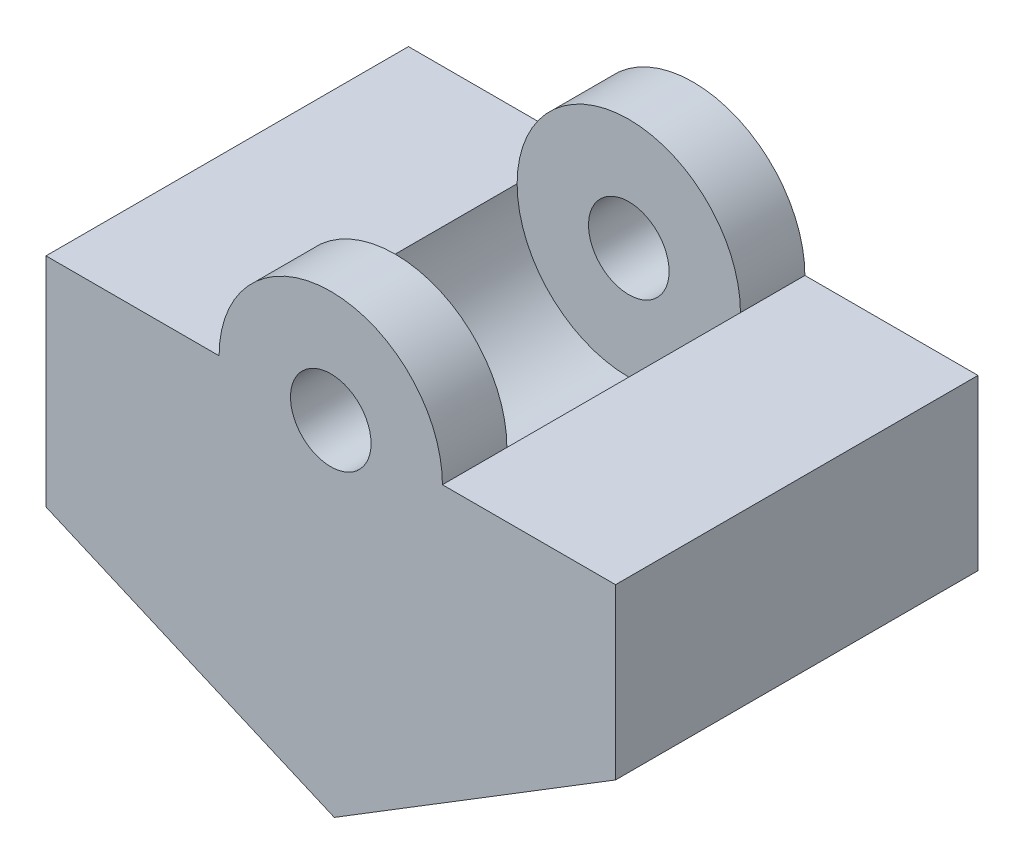
ISO-10303-21;
HEADER;
FILE_DESCRIPTION(('STEP AP214'),'2;1');
FILE_NAME('part.step','',(''),(''),'','','');
FILE_SCHEMA(('AUTOMOTIVE_DESIGN { 1 0 10303 214 1 1 1 1 }'));
ENDSEC;
DATA;
#1=APPLICATION_CONTEXT('core data for automotive mechanical design processes');
#2=APPLICATION_PROTOCOL_DEFINITION('international standard','automotive_design',2000,#1);
#3=PRODUCT_CONTEXT('',#1,'mechanical');
#4=PRODUCT('Part','Part','',(#3));
#5=PRODUCT_RELATED_PRODUCT_CATEGORY('part','',(#4));
#6=PRODUCT_DEFINITION_FORMATION('','',#4);
#7=PRODUCT_DEFINITION_CONTEXT('part definition',#1,'design');
#8=PRODUCT_DEFINITION('design','',#6,#7);
#9=PRODUCT_DEFINITION_SHAPE('','',#8);
#10=(LENGTH_UNIT() NAMED_UNIT(*) SI_UNIT(.MILLI.,.METRE.));
#11=(NAMED_UNIT(*) PLANE_ANGLE_UNIT() SI_UNIT($,.RADIAN.));
#12=(NAMED_UNIT(*) SI_UNIT($,.STERADIAN.) SOLID_ANGLE_UNIT());
#13=UNCERTAINTY_MEASURE_WITH_UNIT(LENGTH_MEASURE(1.E-05),#10,'distance_accuracy_value','');
#14=(GEOMETRIC_REPRESENTATION_CONTEXT(3) GLOBAL_UNCERTAINTY_ASSIGNED_CONTEXT((#13)) GLOBAL_UNIT_ASSIGNED_CONTEXT((#10,
#11,#12)) REPRESENTATION_CONTEXT('',''));
#15=CARTESIAN_POINT('',(0.,0.,0.));
#16=DIRECTION('',(0.,0.,1.));
#17=DIRECTION('',(1.,0.,0.));
#18=AXIS2_PLACEMENT_3D('',#15,#16,#17);
#19=CARTESIAN_POINT('',(-0.437210516499038,42.4860619414088,45.));
#20=DIRECTION('',(0.,0.,-1.));
#21=DIRECTION('',(-1.,0.,0.));
#22=AXIS2_PLACEMENT_3D('',#19,#20,#21);
#23=CYLINDRICAL_SURFACE('',#22,13.864092280803);
#24=CARTESIAN_POINT('',(-0.437210516499035,42.4860619414088,8.));
#25=DIRECTION('',(0.,0.,1.));
#26=DIRECTION('',(1.,0.,0.));
#27=AXIS2_PLACEMENT_3D('',#24,#25,#26);
#28=CIRCLE('',#27,13.864092280803);
#29=CARTESIAN_POINT('',(-14.301302797302,42.4860619414088,8.00000000000001));
#30=VERTEX_POINT('',#29);
#31=CARTESIAN_POINT('',(13.426881764304,42.4860619414088,8.));
#32=VERTEX_POINT('',#31);
#33=EDGE_CURVE('E187',#30,#32,#28,.F.);
#34=ORIENTED_EDGE('',*,*,#33,.T.);
#35=DIRECTION('',(0.,0.,-1.));
#36=VECTOR('',#35,1.);
#37=CARTESIAN_POINT('',(13.426881764304,42.4860619414088,45.));
#38=LINE('',#37,#36);
#39=CARTESIAN_POINT('',(13.426881764304,42.4860619414088,0.));
#40=VERTEX_POINT('',#39);
#41=EDGE_CURVE('E165',#32,#40,#38,.T.);
#42=ORIENTED_EDGE('',*,*,#41,.T.);
#43=CARTESIAN_POINT('',(-0.437210516499038,42.4860619414088,0.));
#44=DIRECTION('',(0.,0.,1.));
#45=DIRECTION('',(1.,0.,0.));
#46=AXIS2_PLACEMENT_3D('',#43,#44,#45);
#47=CIRCLE('',#46,13.864092280803);
#48=CARTESIAN_POINT('',(-14.301302797302,42.4860619414088,0.));
#49=VERTEX_POINT('',#48);
#50=EDGE_CURVE('E153',#40,#49,#47,.T.);
#51=ORIENTED_EDGE('',*,*,#50,.T.);
#52=DIRECTION('',(0.,0.,-1.));
#53=VECTOR('',#52,1.);
#54=CARTESIAN_POINT('',(-14.301302797302,42.4860619414088,45.));
#55=LINE('',#54,#53);
#56=EDGE_CURVE('E135',#30,#49,#55,.T.);
#57=ORIENTED_EDGE('',*,*,#56,.F.);
#58=EDGE_LOOP('',(#34,#42,#51,#57));
#59=FACE_BOUND('',#58,.T.);
#60=ADVANCED_FACE('F41',(#59),#23,.T.);
#61=CARTESIAN_POINT('',(34.9191801485938,21.4860619414088,45.));
#62=DIRECTION('',(-0.524050291253873,0.851687320697409,0.));
#63=DIRECTION('',(-0.851687320697409,-0.524050291253873,0.));
#64=AXIS2_PLACEMENT_3D('',#61,#62,#63);
#65=PLANE('',#64);
#66=DIRECTION('',(0.851687320697409,0.524050291253873,0.));
#67=VECTOR('',#66,1.);
#68=CARTESIAN_POINT('',(34.9191801485938,21.4860619414088,0.));
#69=LINE('',#68,#67);
#70=CARTESIAN_POINT('',(0.,0.,0.));
#71=VERTEX_POINT('',#70);
#72=CARTESIAN_POINT('',(34.9191801485938,21.4860619414088,0.));
#73=VERTEX_POINT('',#72);
#74=EDGE_CURVE('E144',#71,#73,#69,.T.);
#75=ORIENTED_EDGE('',*,*,#74,.T.);
#76=DIRECTION('',(0.,0.,-1.));
#77=VECTOR('',#76,1.);
#78=CARTESIAN_POINT('',(34.9191801485938,21.4860619414088,45.));
#79=LINE('',#78,#77);
#80=CARTESIAN_POINT('',(34.9191801485938,21.4860619414088,45.));
#81=VERTEX_POINT('',#80);
#82=EDGE_CURVE('E12',#81,#73,#79,.T.);
#83=ORIENTED_EDGE('',*,*,#82,.F.);
#84=DIRECTION('',(0.851687320697409,0.524050291253873,0.));
#85=VECTOR('',#84,1.);
#86=CARTESIAN_POINT('',(34.9191801485938,21.4860619414088,45.));
#87=LINE('',#86,#85);
#88=CARTESIAN_POINT('',(0.,0.,45.));
#89=VERTEX_POINT('',#88);
#90=EDGE_CURVE('E160',#89,#81,#87,.T.);
#91=ORIENTED_EDGE('',*,*,#90,.F.);
#92=DIRECTION('',(0.,0.,-1.));
#93=VECTOR('',#92,1.);
#94=CARTESIAN_POINT('',(0.,0.,45.));
#95=LINE('',#94,#93);
#96=EDGE_CURVE('E140',#89,#71,#95,.T.);
#97=ORIENTED_EDGE('',*,*,#96,.T.);
#98=EDGE_LOOP('',(#75,#83,#91,#97));
#99=FACE_BOUND('',#98,.T.);
#100=ADVANCED_FACE('F43',(#99),#65,.F.);
#101=CARTESIAN_POINT('',(34.9191801485938,42.4860619414088,45.));
#102=DIRECTION('',(-1.,0.,0.));
#103=DIRECTION('',(0.,0.,1.));
#104=AXIS2_PLACEMENT_3D('',#101,#102,#103);
#105=PLANE('',#104);
#106=DIRECTION('',(0.,1.,0.));
#107=VECTOR('',#106,1.);
#108=CARTESIAN_POINT('',(34.9191801485938,42.4860619414088,0.));
#109=LINE('',#108,#107);
#110=CARTESIAN_POINT('',(34.9191801485938,42.4860619414088,0.));
#111=VERTEX_POINT('',#110);
#112=EDGE_CURVE('E147',#73,#111,#109,.T.);
#113=ORIENTED_EDGE('',*,*,#112,.T.);
#114=DIRECTION('',(0.,0.,-1.));
#115=VECTOR('',#114,1.);
#116=CARTESIAN_POINT('',(34.9191801485938,42.4860619414088,45.));
#117=LINE('',#116,#115);
#118=CARTESIAN_POINT('',(34.9191801485938,42.4860619414088,45.));
#119=VERTEX_POINT('',#118);
#120=EDGE_CURVE('E50',#119,#111,#117,.T.);
#121=ORIENTED_EDGE('',*,*,#120,.F.);
#122=DIRECTION('',(0.,1.,0.));
#123=VECTOR('',#122,1.);
#124=CARTESIAN_POINT('',(34.9191801485938,42.4860619414088,45.));
#125=LINE('',#124,#123);
#126=EDGE_CURVE('E104',#81,#119,#125,.T.);
#127=ORIENTED_EDGE('',*,*,#126,.F.);
#128=ORIENTED_EDGE('',*,*,#82,.T.);
#129=EDGE_LOOP('',(#113,#121,#127,#128));
#130=FACE_BOUND('',#129,.T.);
#131=ADVANCED_FACE('F214',(#130),#105,.F.);
#132=CARTESIAN_POINT('',(13.426881764304,42.4860619414088,45.));
#133=DIRECTION('',(0.,-1.,0.));
#134=DIRECTION('',(1.,0.,0.));
#135=AXIS2_PLACEMENT_3D('',#132,#133,#134);
#136=PLANE('',#135);
#137=DIRECTION('',(-1.,0.,0.));
#138=VECTOR('',#137,1.);
#139=CARTESIAN_POINT('',(13.426881764304,42.4860619414088,0.));
#140=LINE('',#139,#138);
#141=EDGE_CURVE('E150',#111,#40,#140,.T.);
#142=ORIENTED_EDGE('',*,*,#141,.T.);
#143=ORIENTED_EDGE('',*,*,#41,.F.);
#144=DIRECTION('',(0.,0.,1.));
#145=VECTOR('',#144,1.);
#146=CARTESIAN_POINT('',(13.426881764304,42.4860619414088,-39.2135746670075));
#147=LINE('',#146,#145);
#148=CARTESIAN_POINT('',(13.426881764304,42.4860619414088,37.));
#149=VERTEX_POINT('',#148);
#150=EDGE_CURVE('E148',#32,#149,#147,.T.);
#151=ORIENTED_EDGE('',*,*,#150,.T.);
#152=CARTESIAN_POINT('',(13.426881764304,42.4860619414088,45.));
#153=VERTEX_POINT('',#152);
#154=EDGE_CURVE('E167',#153,#149,#38,.T.);
#155=ORIENTED_EDGE('',*,*,#154,.F.);
#156=DIRECTION('',(-1.,0.,0.));
#157=VECTOR('',#156,1.);
#158=CARTESIAN_POINT('',(13.426881764304,42.4860619414088,45.));
#159=LINE('',#158,#157);
#160=EDGE_CURVE('E178',#119,#153,#159,.T.);
#161=ORIENTED_EDGE('',*,*,#160,.F.);
#162=ORIENTED_EDGE('',*,*,#120,.T.);
#163=EDGE_LOOP('',(#142,#143,#151,#155,#161,#162));
#164=FACE_BOUND('',#163,.T.);
#165=ADVANCED_FACE('F174',(#164),#136,.F.);
#166=ORIENTED_EDGE('',*,*,#154,.T.);
#167=CARTESIAN_POINT('',(-0.437210516499035,42.4860619414088,37.));
#168=DIRECTION('',(0.,0.,1.));
#169=DIRECTION('',(1.,0.,0.));
#170=AXIS2_PLACEMENT_3D('',#167,#168,#169);
#171=CIRCLE('',#170,13.864092280803);
#172=CARTESIAN_POINT('',(-14.301302797302,42.4860619414088,37.));
#173=VERTEX_POINT('',#172);
#174=EDGE_CURVE('E199',#149,#173,#171,.T.);
#175=ORIENTED_EDGE('',*,*,#174,.T.);
#176=CARTESIAN_POINT('',(-14.301302797302,42.4860619414088,45.));
#177=VERTEX_POINT('',#176);
#178=EDGE_CURVE('E163',#177,#173,#55,.T.);
#179=ORIENTED_EDGE('',*,*,#178,.F.);
#180=CARTESIAN_POINT('',(-0.437210516499038,42.4860619414088,45.));
#181=DIRECTION('',(0.,0.,1.));
#182=DIRECTION('',(1.,0.,0.));
#183=AXIS2_PLACEMENT_3D('',#180,#181,#182);
#184=CIRCLE('',#183,13.864092280803);
#185=EDGE_CURVE('E123',#153,#177,#184,.T.);
#186=ORIENTED_EDGE('',*,*,#185,.F.);
#187=EDGE_LOOP('',(#166,#175,#179,#186));
#188=FACE_BOUND('',#187,.T.);
#189=ADVANCED_FACE('F203',(#188),#23,.T.);
#190=CARTESIAN_POINT('',(-35.7936011815918,42.4860619414088,45.));
#191=DIRECTION('',(0.,-1.,0.));
#192=DIRECTION('',(0.,0.,-1.));
#193=AXIS2_PLACEMENT_3D('',#190,#191,#192);
#194=PLANE('',#193);
#195=DIRECTION('',(-1.,0.,0.));
#196=VECTOR('',#195,1.);
#197=CARTESIAN_POINT('',(-35.7936011815918,42.4860619414088,0.));
#198=LINE('',#197,#196);
#199=CARTESIAN_POINT('',(-35.7936011815918,42.4860619414088,0.));
#200=VERTEX_POINT('',#199);
#201=EDGE_CURVE('E132',#49,#200,#198,.T.);
#202=ORIENTED_EDGE('',*,*,#201,.T.);
#203=DIRECTION('',(0.,0.,-1.));
#204=VECTOR('',#203,1.);
#205=CARTESIAN_POINT('',(-35.7936011815918,42.4860619414088,45.));
#206=LINE('',#205,#204);
#207=CARTESIAN_POINT('',(-35.7936011815918,42.4860619414088,45.));
#208=VERTEX_POINT('',#207);
#209=EDGE_CURVE('E129',#208,#200,#206,.T.);
#210=ORIENTED_EDGE('',*,*,#209,.F.);
#211=DIRECTION('',(-1.,0.,0.));
#212=VECTOR('',#211,1.);
#213=CARTESIAN_POINT('',(-35.7936011815918,42.4860619414088,45.));
#214=LINE('',#213,#212);
#215=EDGE_CURVE('E116',#177,#208,#214,.T.);
#216=ORIENTED_EDGE('',*,*,#215,.F.);
#217=ORIENTED_EDGE('',*,*,#178,.T.);
#218=EDGE_CURVE('E166',#173,#30,#55,.T.);
#219=ORIENTED_EDGE('',*,*,#218,.T.);
#220=ORIENTED_EDGE('',*,*,#56,.T.);
#221=EDGE_LOOP('',(#202,#210,#216,#217,#219,#220));
#222=FACE_BOUND('',#221,.T.);
#223=ADVANCED_FACE('F130',(#222),#194,.F.);
#224=CARTESIAN_POINT('',(-35.7936011815918,15.4860619414088,45.));
#225=DIRECTION('',(1.,0.,0.));
#226=DIRECTION('',(0.,0.,-1.));
#227=AXIS2_PLACEMENT_3D('',#224,#225,#226);
#228=PLANE('',#227);
#229=DIRECTION('',(0.,-1.,0.));
#230=VECTOR('',#229,1.);
#231=CARTESIAN_POINT('',(-35.7936011815918,15.4860619414088,0.));
#232=LINE('',#231,#230);
#233=CARTESIAN_POINT('',(-35.7936011815918,15.4860619414088,0.));
#234=VERTEX_POINT('',#233);
#235=EDGE_CURVE('E157',#200,#234,#232,.T.);
#236=ORIENTED_EDGE('',*,*,#235,.T.);
#237=DIRECTION('',(0.,0.,-1.));
#238=VECTOR('',#237,1.);
#239=CARTESIAN_POINT('',(-35.7936011815918,15.4860619414088,45.));
#240=LINE('',#239,#238);
#241=CARTESIAN_POINT('',(-35.7936011815918,15.4860619414088,45.));
#242=VERTEX_POINT('',#241);
#243=EDGE_CURVE('E136',#242,#234,#240,.T.);
#244=ORIENTED_EDGE('',*,*,#243,.F.);
#245=DIRECTION('',(0.,-1.,0.));
#246=VECTOR('',#245,1.);
#247=CARTESIAN_POINT('',(-35.7936011815918,15.4860619414088,45.));
#248=LINE('',#247,#246);
#249=EDGE_CURVE('E120',#208,#242,#248,.T.);
#250=ORIENTED_EDGE('',*,*,#249,.F.);
#251=ORIENTED_EDGE('',*,*,#209,.T.);
#252=EDGE_LOOP('',(#236,#244,#250,#251));
#253=FACE_BOUND('',#252,.T.);
#254=ADVANCED_FACE('F138',(#253),#228,.F.);
#255=CARTESIAN_POINT('',(0.,0.,45.));
#256=DIRECTION('',(0.397078511318174,0.917784645681841,0.));
#257=DIRECTION('',(-0.917784645681841,0.397078511318174,0.));
#258=AXIS2_PLACEMENT_3D('',#255,#256,#257);
#259=PLANE('',#258);
#260=DIRECTION('',(0.917784645681841,-0.397078511318174,0.));
#261=VECTOR('',#260,1.);
#262=CARTESIAN_POINT('',(0.,0.,0.));
#263=LINE('',#262,#261);
#264=EDGE_CURVE('E96',#234,#71,#263,.T.);
#265=ORIENTED_EDGE('',*,*,#264,.T.);
#266=ORIENTED_EDGE('',*,*,#96,.F.);
#267=DIRECTION('',(0.917784645681841,-0.397078511318174,0.));
#268=VECTOR('',#267,1.);
#269=CARTESIAN_POINT('',(0.,0.,45.));
#270=LINE('',#269,#268);
#271=EDGE_CURVE('E66',#242,#89,#270,.T.);
#272=ORIENTED_EDGE('',*,*,#271,.F.);
#273=ORIENTED_EDGE('',*,*,#243,.T.);
#274=EDGE_LOOP('',(#265,#266,#272,#273));
#275=FACE_BOUND('',#274,.T.);
#276=ADVANCED_FACE('F235',(#275),#259,.F.);
#277=CARTESIAN_POINT('',(-0.437210516499038,42.4860619414088,45.));
#278=DIRECTION('',(0.,0.,1.));
#279=DIRECTION('',(1.,0.,0.));
#280=AXIS2_PLACEMENT_3D('',#277,#278,#279);
#281=PLANE('',#280);
#282=CARTESIAN_POINT('',(-0.437210516499035,42.4860619414088,45.));
#283=DIRECTION('',(0.,0.,1.));
#284=DIRECTION('',(1.,0.,0.));
#285=AXIS2_PLACEMENT_3D('',#282,#283,#284);
#286=CIRCLE('',#285,5.);
#287=CARTESIAN_POINT('',(4.56278948350097,42.4860619414088,45.));
#288=VERTEX_POINT('',#287);
#289=EDGE_CURVE('E267',#288,#288,#286,.T.);
#290=ORIENTED_EDGE('',*,*,#289,.F.);
#291=EDGE_LOOP('',(#290));
#292=FACE_BOUND('',#291,.T.);
#293=ORIENTED_EDGE('',*,*,#90,.T.);
#294=ORIENTED_EDGE('',*,*,#126,.T.);
#295=ORIENTED_EDGE('',*,*,#160,.T.);
#296=ORIENTED_EDGE('',*,*,#185,.T.);
#297=ORIENTED_EDGE('',*,*,#215,.T.);
#298=ORIENTED_EDGE('',*,*,#249,.T.);
#299=ORIENTED_EDGE('',*,*,#271,.T.);
#300=EDGE_LOOP('',(#293,#294,#295,#296,#297,#298,#299));
#301=FACE_BOUND('',#300,.T.);
#302=ADVANCED_FACE('F118',(#292,#301),#281,.T.);
#303=CARTESIAN_POINT('',(-0.437210516499038,42.4860619414088,0.));
#304=DIRECTION('',(0.,0.,1.));
#305=DIRECTION('',(1.,0.,0.));
#306=AXIS2_PLACEMENT_3D('',#303,#304,#305);
#307=PLANE('',#306);
#308=CARTESIAN_POINT('',(-0.437210516499035,42.4860619414088,0.));
#309=DIRECTION('',(0.,0.,1.));
#310=DIRECTION('',(1.,0.,0.));
#311=AXIS2_PLACEMENT_3D('',#308,#309,#310);
#312=CIRCLE('',#311,5.);
#313=CARTESIAN_POINT('',(4.56278948350097,42.4860619414088,0.));
#314=VERTEX_POINT('',#313);
#315=EDGE_CURVE('E266',#314,#314,#312,.T.);
#316=ORIENTED_EDGE('',*,*,#315,.T.);
#317=EDGE_LOOP('',(#316));
#318=FACE_BOUND('',#317,.T.);
#319=ORIENTED_EDGE('',*,*,#74,.F.);
#320=ORIENTED_EDGE('',*,*,#264,.F.);
#321=ORIENTED_EDGE('',*,*,#235,.F.);
#322=ORIENTED_EDGE('',*,*,#201,.F.);
#323=ORIENTED_EDGE('',*,*,#50,.F.);
#324=ORIENTED_EDGE('',*,*,#141,.F.);
#325=ORIENTED_EDGE('',*,*,#112,.F.);
#326=EDGE_LOOP('',(#319,#320,#321,#322,#323,#324,#325));
#327=FACE_BOUND('',#326,.T.);
#328=ADVANCED_FACE('F181',(#318,#327),#307,.F.);
#329=CARTESIAN_POINT('',(-0.437210516499035,42.4860619414088,-39.2135746670075));
#330=DIRECTION('',(0.,0.,1.));
#331=DIRECTION('',(1.,0.,0.));
#332=AXIS2_PLACEMENT_3D('',#329,#330,#331);
#333=CYLINDRICAL_SURFACE('',#332,13.864092280803);
#334=EDGE_CURVE('E57',#32,#30,#28,.F.);
#335=ORIENTED_EDGE('',*,*,#334,.T.);
#336=ORIENTED_EDGE('',*,*,#218,.F.);
#337=EDGE_CURVE('E193',#173,#149,#171,.T.);
#338=ORIENTED_EDGE('',*,*,#337,.T.);
#339=ORIENTED_EDGE('',*,*,#150,.F.);
#340=EDGE_LOOP('',(#335,#336,#338,#339));
#341=FACE_BOUND('',#340,.T.);
#342=ADVANCED_FACE('F195',(#341),#333,.F.);
#343=CARTESIAN_POINT('',(-0.437210516499035,42.4860619414088,37.));
#344=DIRECTION('',(0.,0.,1.));
#345=DIRECTION('',(1.,0.,0.));
#346=AXIS2_PLACEMENT_3D('',#343,#344,#345);
#347=PLANE('',#346);
#348=CARTESIAN_POINT('',(-0.437210516499035,42.4860619414088,37.));
#349=DIRECTION('',(0.,0.,1.));
#350=DIRECTION('',(1.,0.,0.));
#351=AXIS2_PLACEMENT_3D('',#348,#349,#350);
#352=CIRCLE('',#351,5.);
#353=CARTESIAN_POINT('',(4.56278948350097,42.4860619414088,37.));
#354=VERTEX_POINT('',#353);
#355=EDGE_CURVE('E200',#354,#354,#352,.T.);
#356=ORIENTED_EDGE('',*,*,#355,.T.);
#357=EDGE_LOOP('',(#356));
#358=FACE_BOUND('',#357,.T.);
#359=ORIENTED_EDGE('',*,*,#174,.F.);
#360=ORIENTED_EDGE('',*,*,#337,.F.);
#361=EDGE_LOOP('',(#359,#360));
#362=FACE_BOUND('',#361,.T.);
#363=ADVANCED_FACE('F198',(#358,#362),#347,.F.);
#364=CARTESIAN_POINT('',(-0.437210516499038,42.4860619414088,8.));
#365=DIRECTION('',(0.,0.,1.));
#366=DIRECTION('',(1.,0.,0.));
#367=AXIS2_PLACEMENT_3D('',#364,#365,#366);
#368=PLANE('',#367);
#369=CARTESIAN_POINT('',(-0.437210516499035,42.4860619414088,8.));
#370=DIRECTION('',(0.,0.,1.));
#371=DIRECTION('',(1.,0.,0.));
#372=AXIS2_PLACEMENT_3D('',#369,#370,#371);
#373=CIRCLE('',#372,5.);
#374=CARTESIAN_POINT('',(4.56278948350097,42.4860619414088,8.));
#375=VERTEX_POINT('',#374);
#376=EDGE_CURVE('E45',#375,#375,#373,.T.);
#377=ORIENTED_EDGE('',*,*,#376,.F.);
#378=EDGE_LOOP('',(#377));
#379=FACE_BOUND('',#378,.T.);
#380=ORIENTED_EDGE('',*,*,#334,.F.);
#381=ORIENTED_EDGE('',*,*,#33,.F.);
#382=EDGE_LOOP('',(#380,#381));
#383=FACE_BOUND('',#382,.T.);
#384=ADVANCED_FACE('F248',(#379,#383),#368,.T.);
#385=CARTESIAN_POINT('',(-0.437210516499035,42.4860619414088,0.));
#386=DIRECTION('',(0.,0.,1.));
#387=DIRECTION('',(1.,0.,0.));
#388=AXIS2_PLACEMENT_3D('',#385,#386,#387);
#389=CYLINDRICAL_SURFACE('',#388,5.);
#390=CARTESIAN_POINT('',(4.56278948350097,42.4860619414088,8.));
#391=CARTESIAN_POINT('',(4.56278948350097,42.4860619414088,7.91666666666667));
#392=CARTESIAN_POINT('',(4.56278948350097,42.4860619414088,7.83333333333333));
#393=CARTESIAN_POINT('',(4.56278948350097,42.4860619414088,7.66666666666667));
#394=CARTESIAN_POINT('',(4.56278948350097,42.4860619414088,7.58333333333333));
#395=CARTESIAN_POINT('',(4.56278948350097,42.4860619414088,7.41666666666667));
#396=CARTESIAN_POINT('',(4.56278948350097,42.4860619414088,7.33333333333333));
#397=CARTESIAN_POINT('',(4.56278948350097,42.4860619414088,7.16666666666667));
#398=CARTESIAN_POINT('',(4.56278948350097,42.4860619414088,7.08333333333333));
#399=CARTESIAN_POINT('',(4.56278948350097,42.4860619414088,6.91666666666667));
#400=CARTESIAN_POINT('',(4.56278948350097,42.4860619414088,6.83333333333333));
#401=CARTESIAN_POINT('',(4.56278948350097,42.4860619414088,6.66666666666667));
#402=CARTESIAN_POINT('',(4.56278948350097,42.4860619414088,6.58333333333333));
#403=CARTESIAN_POINT('',(4.56278948350097,42.4860619414088,6.41666666666667));
#404=CARTESIAN_POINT('',(4.56278948350097,42.4860619414088,6.33333333333333));
#405=CARTESIAN_POINT('',(4.56278948350097,42.4860619414088,6.16666666666667));
#406=CARTESIAN_POINT('',(4.56278948350097,42.4860619414088,6.08333333333333));
#407=CARTESIAN_POINT('',(4.56278948350097,42.4860619414088,5.91666666666667));
#408=CARTESIAN_POINT('',(4.56278948350097,42.4860619414088,5.83333333333333));
#409=CARTESIAN_POINT('',(4.56278948350097,42.4860619414088,5.66666666666667));
#410=CARTESIAN_POINT('',(4.56278948350097,42.4860619414088,5.58333333333333));
#411=CARTESIAN_POINT('',(4.56278948350097,42.4860619414088,5.41666666666667));
#412=CARTESIAN_POINT('',(4.56278948350097,42.4860619414088,5.33333333333333));
#413=CARTESIAN_POINT('',(4.56278948350097,42.4860619414088,5.16666666666667));
#414=CARTESIAN_POINT('',(4.56278948350097,42.4860619414088,5.08333333333333));
#415=CARTESIAN_POINT('',(4.56278948350097,42.4860619414088,4.91666666666667));
#416=CARTESIAN_POINT('',(4.56278948350097,42.4860619414088,4.83333333333333));
#417=CARTESIAN_POINT('',(4.56278948350097,42.4860619414088,4.66666666666667));
#418=CARTESIAN_POINT('',(4.56278948350097,42.4860619414088,4.58333333333333));
#419=CARTESIAN_POINT('',(4.56278948350097,42.4860619414088,4.41666666666667));
#420=CARTESIAN_POINT('',(4.56278948350097,42.4860619414088,4.33333333333333));
#421=CARTESIAN_POINT('',(4.56278948350097,42.4860619414088,4.16666666666667));
#422=CARTESIAN_POINT('',(4.56278948350097,42.4860619414088,4.08333333333333));
#423=CARTESIAN_POINT('',(4.56278948350097,42.4860619414088,3.91666666666667));
#424=CARTESIAN_POINT('',(4.56278948350097,42.4860619414088,3.83333333333333));
#425=CARTESIAN_POINT('',(4.56278948350097,42.4860619414088,3.66666666666667));
#426=CARTESIAN_POINT('',(4.56278948350097,42.4860619414088,3.58333333333333));
#427=CARTESIAN_POINT('',(4.56278948350097,42.4860619414088,3.41666666666667));
#428=CARTESIAN_POINT('',(4.56278948350097,42.4860619414088,3.33333333333333));
#429=CARTESIAN_POINT('',(4.56278948350097,42.4860619414088,3.16666666666667));
#430=CARTESIAN_POINT('',(4.56278948350097,42.4860619414088,3.08333333333333));
#431=CARTESIAN_POINT('',(4.56278948350097,42.4860619414088,2.91666666666667));
#432=CARTESIAN_POINT('',(4.56278948350097,42.4860619414088,2.83333333333333));
#433=CARTESIAN_POINT('',(4.56278948350097,42.4860619414088,2.66666666666667));
#434=CARTESIAN_POINT('',(4.56278948350097,42.4860619414088,2.58333333333333));
#435=CARTESIAN_POINT('',(4.56278948350097,42.4860619414088,2.41666666666667));
#436=CARTESIAN_POINT('',(4.56278948350097,42.4860619414088,2.33333333333333));
#437=CARTESIAN_POINT('',(4.56278948350097,42.4860619414088,2.16666666666667));
#438=CARTESIAN_POINT('',(4.56278948350097,42.4860619414088,2.08333333333333));
#439=CARTESIAN_POINT('',(4.56278948350097,42.4860619414088,1.91666666666667));
#440=CARTESIAN_POINT('',(4.56278948350097,42.4860619414088,1.83333333333333));
#441=CARTESIAN_POINT('',(4.56278948350097,42.4860619414088,1.66666666666667));
#442=CARTESIAN_POINT('',(4.56278948350097,42.4860619414088,1.58333333333333));
#443=CARTESIAN_POINT('',(4.56278948350097,42.4860619414088,1.41666666666667));
#444=CARTESIAN_POINT('',(4.56278948350097,42.4860619414088,1.33333333333333));
#445=CARTESIAN_POINT('',(4.56278948350097,42.4860619414088,1.16666666666667));
#446=CARTESIAN_POINT('',(4.56278948350097,42.4860619414088,1.08333333333333));
#447=CARTESIAN_POINT('',(4.56278948350097,42.4860619414088,0.916666666666666));
#448=CARTESIAN_POINT('',(4.56278948350097,42.4860619414088,0.833333333333333));
#449=CARTESIAN_POINT('',(4.56278948350097,42.4860619414088,0.666666666666667));
#450=CARTESIAN_POINT('',(4.56278948350097,42.4860619414088,0.583333333333333));
#451=CARTESIAN_POINT('',(4.56278948350097,42.4860619414088,0.416666666666667));
#452=CARTESIAN_POINT('',(4.56278948350097,42.4860619414088,0.333333333333334));
#453=CARTESIAN_POINT('',(4.56278948350097,42.4860619414088,0.166666666666667));
#454=CARTESIAN_POINT('',(4.56278948350097,42.4860619414088,0.0833333333333333));
#455=CARTESIAN_POINT('',(4.56278948350097,42.4860619414088,0.));
#456=B_SPLINE_CURVE_WITH_KNOTS('',3,(#390,#391,#392,#393,#394,#395,#396,#397,#398,#399,#400,
#401,#402,#403,#404,#405,#406,#407,#408,#409,#410,#411,#412,#413,#414,#415,#416,#417,#418,#419,
#420,#421,#422,#423,#424,#425,#426,#427,#428,#429,#430,#431,#432,#433,#434,#435,#436,#437,#438,
#439,#440,#441,#442,#443,#444,#445,#446,#447,#448,#449,#450,#451,#452,#453,#454,#455),
.UNSPECIFIED.,.F.,.F.,(4,2,2,2,2,2,2,2,2,2,2,2,2,2,2,2,2,2,2,2,2,2,2,2,2,2,2,2,2,2,2,2,4),(0.,
0.249999999999999,0.5,0.749999999999999,0.999999999999999,1.25,1.5,1.75,2.,2.25,2.5,2.75,3.,
3.25,3.5,3.75,4.,4.25,4.5,4.75,5.,5.25,5.5,5.75,6.,6.25,6.5,6.75,7.,7.25,7.5,7.75,8.),.UNSPECIFIED.);
#457=EDGE_CURVE('BSEAM252',#375,#314,#456,.T.);
#458=ORIENTED_EDGE('',*,*,#376,.T.);
#459=ORIENTED_EDGE('',*,*,#315,.F.);
#460=ORIENTED_EDGE('',*,*,#457,.T.);
#461=ORIENTED_EDGE('',*,*,#457,.F.);
#462=EDGE_LOOP('',(#458,#460,#459,#461));
#463=FACE_BOUND('',#462,.T.);
#464=ADVANCED_FACE('F252',(#463),#389,.F.);
#465=CARTESIAN_POINT('',(4.56278948350097,42.4860619414088,45.));
#466=CARTESIAN_POINT('',(4.56278948350097,42.4860619414088,44.9166666666667));
#467=CARTESIAN_POINT('',(4.56278948350097,42.4860619414088,44.8333333333333));
#468=CARTESIAN_POINT('',(4.56278948350097,42.4860619414088,44.6666666666667));
#469=CARTESIAN_POINT('',(4.56278948350097,42.4860619414088,44.5833333333333));
#470=CARTESIAN_POINT('',(4.56278948350097,42.4860619414088,44.4166666666667));
#471=CARTESIAN_POINT('',(4.56278948350097,42.4860619414088,44.3333333333333));
#472=CARTESIAN_POINT('',(4.56278948350097,42.4860619414088,44.1666666666667));
#473=CARTESIAN_POINT('',(4.56278948350097,42.4860619414088,44.0833333333333));
#474=CARTESIAN_POINT('',(4.56278948350097,42.4860619414088,43.9166666666667));
#475=CARTESIAN_POINT('',(4.56278948350097,42.4860619414088,43.8333333333333));
#476=CARTESIAN_POINT('',(4.56278948350097,42.4860619414088,43.6666666666667));
#477=CARTESIAN_POINT('',(4.56278948350097,42.4860619414088,43.5833333333333));
#478=CARTESIAN_POINT('',(4.56278948350097,42.4860619414088,43.4166666666667));
#479=CARTESIAN_POINT('',(4.56278948350097,42.4860619414088,43.3333333333333));
#480=CARTESIAN_POINT('',(4.56278948350097,42.4860619414088,43.1666666666667));
#481=CARTESIAN_POINT('',(4.56278948350097,42.4860619414088,43.0833333333333));
#482=CARTESIAN_POINT('',(4.56278948350097,42.4860619414088,42.9166666666667));
#483=CARTESIAN_POINT('',(4.56278948350097,42.4860619414088,42.8333333333333));
#484=CARTESIAN_POINT('',(4.56278948350097,42.4860619414088,42.6666666666667));
#485=CARTESIAN_POINT('',(4.56278948350097,42.4860619414088,42.5833333333333));
#486=CARTESIAN_POINT('',(4.56278948350097,42.4860619414088,42.4166666666667));
#487=CARTESIAN_POINT('',(4.56278948350097,42.4860619414088,42.3333333333333));
#488=CARTESIAN_POINT('',(4.56278948350097,42.4860619414088,42.1666666666667));
#489=CARTESIAN_POINT('',(4.56278948350097,42.4860619414088,42.0833333333333));
#490=CARTESIAN_POINT('',(4.56278948350097,42.4860619414088,41.9166666666667));
#491=CARTESIAN_POINT('',(4.56278948350097,42.4860619414088,41.8333333333333));
#492=CARTESIAN_POINT('',(4.56278948350097,42.4860619414088,41.6666666666667));
#493=CARTESIAN_POINT('',(4.56278948350097,42.4860619414088,41.5833333333333));
#494=CARTESIAN_POINT('',(4.56278948350097,42.4860619414088,41.4166666666667));
#495=CARTESIAN_POINT('',(4.56278948350097,42.4860619414088,41.3333333333333));
#496=CARTESIAN_POINT('',(4.56278948350097,42.4860619414088,41.1666666666667));
#497=CARTESIAN_POINT('',(4.56278948350097,42.4860619414088,41.0833333333333));
#498=CARTESIAN_POINT('',(4.56278948350097,42.4860619414088,40.9166666666667));
#499=CARTESIAN_POINT('',(4.56278948350097,42.4860619414088,40.8333333333333));
#500=CARTESIAN_POINT('',(4.56278948350097,42.4860619414088,40.6666666666667));
#501=CARTESIAN_POINT('',(4.56278948350097,42.4860619414088,40.5833333333333));
#502=CARTESIAN_POINT('',(4.56278948350097,42.4860619414088,40.4166666666667));
#503=CARTESIAN_POINT('',(4.56278948350097,42.4860619414088,40.3333333333333));
#504=CARTESIAN_POINT('',(4.56278948350097,42.4860619414088,40.1666666666667));
#505=CARTESIAN_POINT('',(4.56278948350097,42.4860619414088,40.0833333333333));
#506=CARTESIAN_POINT('',(4.56278948350097,42.4860619414088,39.9166666666667));
#507=CARTESIAN_POINT('',(4.56278948350097,42.4860619414088,39.8333333333333));
#508=CARTESIAN_POINT('',(4.56278948350097,42.4860619414088,39.6666666666667));
#509=CARTESIAN_POINT('',(4.56278948350097,42.4860619414088,39.5833333333333));
#510=CARTESIAN_POINT('',(4.56278948350097,42.4860619414088,39.4166666666667));
#511=CARTESIAN_POINT('',(4.56278948350097,42.4860619414088,39.3333333333333));
#512=CARTESIAN_POINT('',(4.56278948350097,42.4860619414088,39.1666666666667));
#513=CARTESIAN_POINT('',(4.56278948350097,42.4860619414088,39.0833333333333));
#514=CARTESIAN_POINT('',(4.56278948350097,42.4860619414088,38.9166666666667));
#515=CARTESIAN_POINT('',(4.56278948350097,42.4860619414088,38.8333333333333));
#516=CARTESIAN_POINT('',(4.56278948350097,42.4860619414088,38.6666666666667));
#517=CARTESIAN_POINT('',(4.56278948350097,42.4860619414088,38.5833333333333));
#518=CARTESIAN_POINT('',(4.56278948350097,42.4860619414088,38.4166666666667));
#519=CARTESIAN_POINT('',(4.56278948350097,42.4860619414088,38.3333333333333));
#520=CARTESIAN_POINT('',(4.56278948350097,42.4860619414088,38.1666666666667));
#521=CARTESIAN_POINT('',(4.56278948350097,42.4860619414088,38.0833333333333));
#522=CARTESIAN_POINT('',(4.56278948350097,42.4860619414088,37.9166666666667));
#523=CARTESIAN_POINT('',(4.56278948350097,42.4860619414088,37.8333333333333));
#524=CARTESIAN_POINT('',(4.56278948350097,42.4860619414088,37.6666666666667));
#525=CARTESIAN_POINT('',(4.56278948350097,42.4860619414088,37.5833333333333));
#526=CARTESIAN_POINT('',(4.56278948350097,42.4860619414088,37.4166666666667));
#527=CARTESIAN_POINT('',(4.56278948350097,42.4860619414088,37.3333333333333));
#528=CARTESIAN_POINT('',(4.56278948350097,42.4860619414088,37.1666666666667));
#529=CARTESIAN_POINT('',(4.56278948350097,42.4860619414088,37.0833333333333));
#530=CARTESIAN_POINT('',(4.56278948350097,42.4860619414088,37.));
#531=B_SPLINE_CURVE_WITH_KNOTS('',3,(#465,#466,#467,#468,#469,#470,#471,#472,#473,#474,#475,
#476,#477,#478,#479,#480,#481,#482,#483,#484,#485,#486,#487,#488,#489,#490,#491,#492,#493,#494,
#495,#496,#497,#498,#499,#500,#501,#502,#503,#504,#505,#506,#507,#508,#509,#510,#511,#512,#513,
#514,#515,#516,#517,#518,#519,#520,#521,#522,#523,#524,#525,#526,#527,#528,#529,#530),
.UNSPECIFIED.,.F.,.F.,(4,2,2,2,2,2,2,2,2,2,2,2,2,2,2,2,2,2,2,2,2,2,2,2,2,2,2,2,2,2,2,2,4),(0.,
0.25,0.5,0.750000000000001,1.,1.25,1.5,1.75,2.,2.25,2.5,2.75,3.,3.25,3.5,3.75,4.,4.25,4.5,4.75,
5.,5.25,5.5,5.74999999999999,5.99999999999999,6.24999999999999,6.49999999999999,
6.74999999999999,6.99999999999999,7.24999999999999,7.49999999999999,7.74999999999999,
7.99999999999999),.UNSPECIFIED.);
#532=EDGE_CURVE('BSEAM255',#288,#354,#531,.T.);
#533=ORIENTED_EDGE('',*,*,#289,.T.);
#534=ORIENTED_EDGE('',*,*,#355,.F.);
#535=ORIENTED_EDGE('',*,*,#532,.T.);
#536=ORIENTED_EDGE('',*,*,#532,.F.);
#537=EDGE_LOOP('',(#533,#535,#534,#536));
#538=FACE_BOUND('',#537,.T.);
#539=ADVANCED_FACE('F255',(#538),#389,.F.);
#540=CLOSED_SHELL('',(#60,#100,#131,#165,#189,#223,#254,#276,#302,#328,#342,#363,#384,#464,#539));
#541=MANIFOLD_SOLID_BREP('B2',#540);
#542=ADVANCED_BREP_SHAPE_REPRESENTATION('',(#18,#541),#14);
#543=SHAPE_DEFINITION_REPRESENTATION(#9,#542);
ENDSEC;
END-ISO-10303-21;
